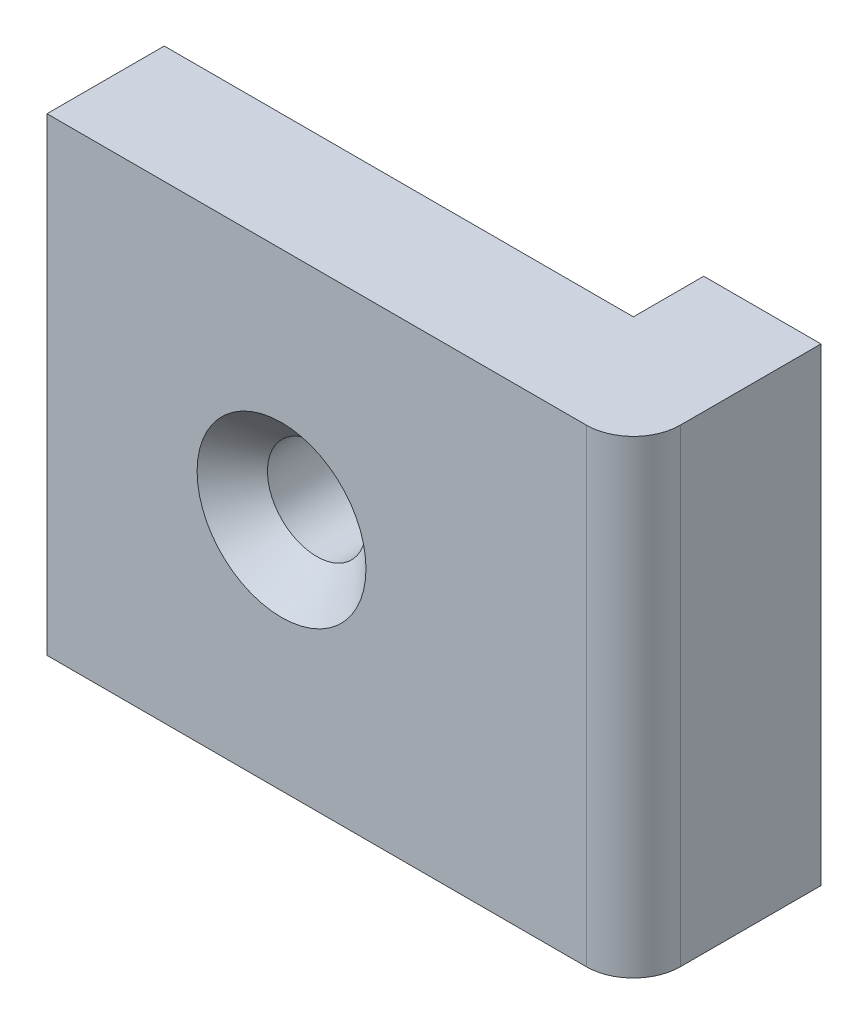
ISO-10303-21;
HEADER;
FILE_DESCRIPTION(('STEP AP214'),'2;1');
FILE_NAME('part.step','',(''),(''),'','','');
FILE_SCHEMA(('AUTOMOTIVE_DESIGN { 1 0 10303 214 1 1 1 1 }'));
ENDSEC;
DATA;
#1=APPLICATION_CONTEXT('core data for automotive mechanical design processes');
#2=APPLICATION_PROTOCOL_DEFINITION('international standard','automotive_design',2000,#1);
#3=PRODUCT_CONTEXT('',#1,'mechanical');
#4=PRODUCT('Part','Part','',(#3));
#5=PRODUCT_RELATED_PRODUCT_CATEGORY('part','',(#4));
#6=PRODUCT_DEFINITION_FORMATION('','',#4);
#7=PRODUCT_DEFINITION_CONTEXT('part definition',#1,'design');
#8=PRODUCT_DEFINITION('design','',#6,#7);
#9=PRODUCT_DEFINITION_SHAPE('','',#8);
#10=(LENGTH_UNIT() NAMED_UNIT(*) SI_UNIT(.MILLI.,.METRE.));
#11=(NAMED_UNIT(*) PLANE_ANGLE_UNIT() SI_UNIT($,.RADIAN.));
#12=(NAMED_UNIT(*) SI_UNIT($,.STERADIAN.) SOLID_ANGLE_UNIT());
#13=UNCERTAINTY_MEASURE_WITH_UNIT(LENGTH_MEASURE(1.E-05),#10,'distance_accuracy_value','');
#14=(GEOMETRIC_REPRESENTATION_CONTEXT(3) GLOBAL_UNCERTAINTY_ASSIGNED_CONTEXT((#13)) GLOBAL_UNIT_ASSIGNED_CONTEXT((#10,
#11,#12)) REPRESENTATION_CONTEXT('',''));
#15=CARTESIAN_POINT('',(0.,0.,0.));
#16=DIRECTION('',(0.,0.,1.));
#17=DIRECTION('',(1.,0.,0.));
#18=AXIS2_PLACEMENT_3D('',#15,#16,#17);
#19=CARTESIAN_POINT('',(0.,0.,0.));
#20=DIRECTION('',(0.,0.,1.));
#21=DIRECTION('',(1.,0.,0.));
#22=AXIS2_PLACEMENT_3D('',#19,#20,#21);
#23=PLANE('',#22);
#24=CARTESIAN_POINT('',(0.,0.,0.));
#25=DIRECTION('',(0.,0.,1.));
#26=DIRECTION('',(1.,0.,0.));
#27=AXIS2_PLACEMENT_3D('',#24,#25,#26);
#28=CIRCLE('',#27,2.1);
#29=CARTESIAN_POINT('',(2.10000000000001,0.,0.));
#30=VERTEX_POINT('',#29);
#31=EDGE_CURVE('E169',#30,#30,#28,.T.);
#32=ORIENTED_EDGE('',*,*,#31,.T.);
#33=EDGE_LOOP('',(#32));
#34=FACE_BOUND('',#33,.T.);
#35=DIRECTION('',(1.,0.,0.));
#36=VECTOR('',#35,1.);
#37=CARTESIAN_POINT('',(7.,2.75,0.));
#38=LINE('',#37,#36);
#39=CARTESIAN_POINT('',(7.,2.75,0.));
#40=VERTEX_POINT('',#39);
#41=CARTESIAN_POINT('',(10.,2.75,0.));
#42=VERTEX_POINT('',#41);
#43=EDGE_CURVE('E310',#40,#42,#38,.T.);
#44=ORIENTED_EDGE('',*,*,#43,.F.);
#45=DIRECTION('',(0.,1.,0.));
#46=VECTOR('',#45,1.);
#47=CARTESIAN_POINT('',(7.,-2.75,0.));
#48=LINE('',#47,#46);
#49=CARTESIAN_POINT('',(7.,-2.75,0.));
#50=VERTEX_POINT('',#49);
#51=EDGE_CURVE('E156',#50,#40,#48,.T.);
#52=ORIENTED_EDGE('',*,*,#51,.F.);
#53=DIRECTION('',(-1.,0.,0.));
#54=VECTOR('',#53,1.);
#55=CARTESIAN_POINT('',(7.,-2.75,0.));
#56=LINE('',#55,#54);
#57=CARTESIAN_POINT('',(10.,-2.75,0.));
#58=VERTEX_POINT('',#57);
#59=EDGE_CURVE('E138',#58,#50,#56,.T.);
#60=ORIENTED_EDGE('',*,*,#59,.F.);
#61=DIRECTION('',(0.,1.,0.));
#62=VECTOR('',#61,1.);
#63=CARTESIAN_POINT('',(10.,9.99999999999999,0.));
#64=LINE('',#63,#62);
#65=CARTESIAN_POINT('',(10.,-10.,0.));
#66=VERTEX_POINT('',#65);
#67=EDGE_CURVE('E153',#66,#58,#64,.T.);
#68=ORIENTED_EDGE('',*,*,#67,.F.);
#69=DIRECTION('',(1.,0.,0.));
#70=VECTOR('',#69,1.);
#71=CARTESIAN_POINT('',(-10.,-10.,0.));
#72=LINE('',#71,#70);
#73=CARTESIAN_POINT('',(-10.,-10.,0.));
#74=VERTEX_POINT('',#73);
#75=EDGE_CURVE('E176',#74,#66,#72,.T.);
#76=ORIENTED_EDGE('',*,*,#75,.F.);
#77=DIRECTION('',(0.,-1.,0.));
#78=VECTOR('',#77,1.);
#79=CARTESIAN_POINT('',(-10.,9.99999999999999,0.));
#80=LINE('',#79,#78);
#81=CARTESIAN_POINT('',(-10.,9.99999999999999,0.));
#82=VERTEX_POINT('',#81);
#83=EDGE_CURVE('E167',#82,#74,#80,.T.);
#84=ORIENTED_EDGE('',*,*,#83,.F.);
#85=DIRECTION('',(-1.,0.,0.));
#86=VECTOR('',#85,1.);
#87=CARTESIAN_POINT('',(-10.,9.99999999999999,0.));
#88=LINE('',#87,#86);
#89=CARTESIAN_POINT('',(10.,9.99999999999999,0.));
#90=VERTEX_POINT('',#89);
#91=EDGE_CURVE('E162',#90,#82,#88,.T.);
#92=ORIENTED_EDGE('',*,*,#91,.F.);
#93=EDGE_CURVE('E163',#42,#90,#64,.T.);
#94=ORIENTED_EDGE('',*,*,#93,.F.);
#95=EDGE_LOOP('',(#44,#52,#60,#68,#76,#84,#92,#94));
#96=FACE_BOUND('',#95,.T.);
#97=ADVANCED_FACE('F47',(#34,#96),#23,.F.);
#98=CARTESIAN_POINT('',(10.,0.,0.));
#99=DIRECTION('',(1.,0.,0.));
#100=DIRECTION('',(0.,1.,0.));
#101=AXIS2_PLACEMENT_3D('',#98,#99,#100);
#102=PLANE('',#101);
#103=DIRECTION('',(0.,0.,1.));
#104=VECTOR('',#103,1.);
#105=CARTESIAN_POINT('',(10.,2.75,-9.26498204307084));
#106=LINE('',#105,#104);
#107=CARTESIAN_POINT('',(10.,2.75,-3.));
#108=VERTEX_POINT('',#107);
#109=EDGE_CURVE('E64',#108,#42,#106,.T.);
#110=ORIENTED_EDGE('',*,*,#109,.T.);
#111=ORIENTED_EDGE('',*,*,#93,.T.);
#112=DIRECTION('',(0.,0.,1.));
#113=VECTOR('',#112,1.);
#114=CARTESIAN_POINT('',(10.,9.99999999999999,5.));
#115=LINE('',#114,#113);
#116=CARTESIAN_POINT('',(10.,9.99999999999999,-3.));
#117=VERTEX_POINT('',#116);
#118=EDGE_CURVE('E281',#117,#90,#115,.T.);
#119=ORIENTED_EDGE('',*,*,#118,.F.);
#120=DIRECTION('',(0.,1.,0.));
#121=VECTOR('',#120,1.);
#122=CARTESIAN_POINT('',(10.,9.99999999999999,-3.));
#123=LINE('',#122,#121);
#124=EDGE_CURVE('E277',#108,#117,#123,.T.);
#125=ORIENTED_EDGE('',*,*,#124,.F.);
#126=EDGE_LOOP('',(#110,#111,#119,#125));
#127=FACE_BOUND('',#126,.T.);
#128=ADVANCED_FACE('F216',(#127),#102,.F.);
#129=DIRECTION('',(0.,0.,1.));
#130=VECTOR('',#129,1.);
#131=CARTESIAN_POINT('',(10.,-2.75,-9.26498204307084));
#132=LINE('',#131,#130);
#133=CARTESIAN_POINT('',(10.,-2.75,-3.));
#134=VERTEX_POINT('',#133);
#135=EDGE_CURVE('E134',#134,#58,#132,.T.);
#136=ORIENTED_EDGE('',*,*,#135,.F.);
#137=CARTESIAN_POINT('',(10.,-10.,-3.));
#138=VERTEX_POINT('',#137);
#139=EDGE_CURVE('E278',#138,#134,#123,.T.);
#140=ORIENTED_EDGE('',*,*,#139,.F.);
#141=DIRECTION('',(0.,0.,-1.));
#142=VECTOR('',#141,1.);
#143=CARTESIAN_POINT('',(10.,-10.,5.));
#144=LINE('',#143,#142);
#145=EDGE_CURVE('E160',#66,#138,#144,.T.);
#146=ORIENTED_EDGE('',*,*,#145,.F.);
#147=ORIENTED_EDGE('',*,*,#67,.T.);
#148=EDGE_LOOP('',(#136,#140,#146,#147));
#149=FACE_BOUND('',#148,.T.);
#150=ADVANCED_FACE('F159',(#149),#102,.F.);
#151=CARTESIAN_POINT('',(0.,0.,5.));
#152=DIRECTION('',(0.,0.,1.));
#153=DIRECTION('',(1.,0.,0.));
#154=AXIS2_PLACEMENT_3D('',#151,#152,#153);
#155=PLANE('',#154);
#156=CARTESIAN_POINT('',(0.,0.,5.));
#157=DIRECTION('',(0.,0.,1.));
#158=DIRECTION('',(1.,0.,0.));
#159=AXIS2_PLACEMENT_3D('',#156,#157,#158);
#160=CIRCLE('',#159,3.6);
#161=CARTESIAN_POINT('',(3.60000000000001,0.,5.));
#162=VERTEX_POINT('',#161);
#163=EDGE_CURVE('E11',#162,#162,#160,.F.);
#164=ORIENTED_EDGE('',*,*,#163,.T.);
#165=EDGE_LOOP('',(#164));
#166=FACE_BOUND('',#165,.T.);
#167=DIRECTION('',(1.,0.,0.));
#168=VECTOR('',#167,1.);
#169=CARTESIAN_POINT('',(-10.,-10.,5.));
#170=LINE('',#169,#168);
#171=CARTESIAN_POINT('',(-10.,-10.,5.));
#172=VERTEX_POINT('',#171);
#173=CARTESIAN_POINT('',(13.,-10.,5.));
#174=VERTEX_POINT('',#173);
#175=EDGE_CURVE('E171',#172,#174,#170,.T.);
#176=ORIENTED_EDGE('',*,*,#175,.T.);
#177=DIRECTION('',(0.,-1.,0.));
#178=VECTOR('',#177,1.);
#179=CARTESIAN_POINT('',(13.,0.,5.));
#180=LINE('',#179,#178);
#181=CARTESIAN_POINT('',(13.,9.99999999999999,5.));
#182=VERTEX_POINT('',#181);
#183=EDGE_CURVE('E72',#174,#182,#180,.F.);
#184=ORIENTED_EDGE('',*,*,#183,.T.);
#185=DIRECTION('',(-1.,0.,0.));
#186=VECTOR('',#185,1.);
#187=CARTESIAN_POINT('',(-10.,9.99999999999999,5.));
#188=LINE('',#187,#186);
#189=CARTESIAN_POINT('',(-10.,9.99999999999999,5.));
#190=VERTEX_POINT('',#189);
#191=EDGE_CURVE('E179',#182,#190,#188,.T.);
#192=ORIENTED_EDGE('',*,*,#191,.T.);
#193=DIRECTION('',(0.,-1.,0.));
#194=VECTOR('',#193,1.);
#195=CARTESIAN_POINT('',(-10.,9.99999999999999,5.));
#196=LINE('',#195,#194);
#197=EDGE_CURVE('E291',#190,#172,#196,.T.);
#198=ORIENTED_EDGE('',*,*,#197,.T.);
#199=EDGE_LOOP('',(#176,#184,#192,#198));
#200=FACE_BOUND('',#199,.T.);
#201=ADVANCED_FACE('F228',(#166,#200),#155,.T.);
#202=CARTESIAN_POINT('',(-10.,9.99999999999999,5.));
#203=DIRECTION('',(0.,-1.,0.));
#204=DIRECTION('',(0.,0.,-1.));
#205=AXIS2_PLACEMENT_3D('',#202,#203,#204);
#206=PLANE('',#205);
#207=ORIENTED_EDGE('',*,*,#191,.F.);
#208=CARTESIAN_POINT('',(13.,9.99999999999999,3.));
#209=DIRECTION('',(0.,-1.,0.));
#210=DIRECTION('',(0.,0.,-1.));
#211=AXIS2_PLACEMENT_3D('',#208,#209,#210);
#212=CIRCLE('',#211,2.);
#213=CARTESIAN_POINT('',(15.,9.99999999999999,3.));
#214=VERTEX_POINT('',#213);
#215=EDGE_CURVE('E197',#182,#214,#212,.F.);
#216=ORIENTED_EDGE('',*,*,#215,.T.);
#217=DIRECTION('',(0.,0.,1.));
#218=VECTOR('',#217,1.);
#219=CARTESIAN_POINT('',(15.,9.99999999999999,5.));
#220=LINE('',#219,#218);
#221=CARTESIAN_POINT('',(15.,9.99999999999999,-3.));
#222=VERTEX_POINT('',#221);
#223=EDGE_CURVE('E258',#222,#214,#220,.T.);
#224=ORIENTED_EDGE('',*,*,#223,.F.);
#225=DIRECTION('',(-1.,0.,0.));
#226=VECTOR('',#225,1.);
#227=CARTESIAN_POINT('',(15.,9.99999999999999,-3.));
#228=LINE('',#227,#226);
#229=EDGE_CURVE('E265',#222,#117,#228,.T.);
#230=ORIENTED_EDGE('',*,*,#229,.T.);
#231=ORIENTED_EDGE('',*,*,#118,.T.);
#232=ORIENTED_EDGE('',*,*,#91,.T.);
#233=DIRECTION('',(0.,0.,-1.));
#234=VECTOR('',#233,1.);
#235=CARTESIAN_POINT('',(-10.,9.99999999999999,5.));
#236=LINE('',#235,#234);
#237=EDGE_CURVE('E184',#190,#82,#236,.T.);
#238=ORIENTED_EDGE('',*,*,#237,.F.);
#239=EDGE_LOOP('',(#207,#216,#224,#230,#231,#232,#238));
#240=FACE_BOUND('',#239,.T.);
#241=ADVANCED_FACE('F237',(#240),#206,.F.);
#242=CARTESIAN_POINT('',(-10.,9.99999999999999,5.));
#243=DIRECTION('',(1.,0.,0.));
#244=DIRECTION('',(0.,0.,-1.));
#245=AXIS2_PLACEMENT_3D('',#242,#243,#244);
#246=PLANE('',#245);
#247=ORIENTED_EDGE('',*,*,#83,.T.);
#248=DIRECTION('',(0.,0.,-1.));
#249=VECTOR('',#248,1.);
#250=CARTESIAN_POINT('',(-10.,-10.,5.));
#251=LINE('',#250,#249);
#252=EDGE_CURVE('E180',#172,#74,#251,.T.);
#253=ORIENTED_EDGE('',*,*,#252,.F.);
#254=ORIENTED_EDGE('',*,*,#197,.F.);
#255=ORIENTED_EDGE('',*,*,#237,.T.);
#256=EDGE_LOOP('',(#247,#253,#254,#255));
#257=FACE_BOUND('',#256,.T.);
#258=ADVANCED_FACE('F233',(#257),#246,.F.);
#259=CARTESIAN_POINT('',(-10.,-10.,5.));
#260=DIRECTION('',(0.,1.,0.));
#261=DIRECTION('',(0.,0.,1.));
#262=AXIS2_PLACEMENT_3D('',#259,#260,#261);
#263=PLANE('',#262);
#264=DIRECTION('',(0.,0.,-1.));
#265=VECTOR('',#264,1.);
#266=CARTESIAN_POINT('',(15.,-10.,5.));
#267=LINE('',#266,#265);
#268=CARTESIAN_POINT('',(15.,-10.,3.));
#269=VERTEX_POINT('',#268);
#270=CARTESIAN_POINT('',(15.,-10.,-3.));
#271=VERTEX_POINT('',#270);
#272=EDGE_CURVE('E271',#269,#271,#267,.T.);
#273=ORIENTED_EDGE('',*,*,#272,.F.);
#274=CARTESIAN_POINT('',(13.,-10.,3.));
#275=DIRECTION('',(0.,1.,0.));
#276=DIRECTION('',(0.,0.,1.));
#277=AXIS2_PLACEMENT_3D('',#274,#275,#276);
#278=CIRCLE('',#277,2.);
#279=EDGE_CURVE('E192',#269,#174,#278,.F.);
#280=ORIENTED_EDGE('',*,*,#279,.T.);
#281=ORIENTED_EDGE('',*,*,#175,.F.);
#282=ORIENTED_EDGE('',*,*,#252,.T.);
#283=ORIENTED_EDGE('',*,*,#75,.T.);
#284=ORIENTED_EDGE('',*,*,#145,.T.);
#285=DIRECTION('',(-1.,0.,0.));
#286=VECTOR('',#285,1.);
#287=CARTESIAN_POINT('',(15.,-10.,-3.));
#288=LINE('',#287,#286);
#289=EDGE_CURVE('E269',#271,#138,#288,.T.);
#290=ORIENTED_EDGE('',*,*,#289,.F.);
#291=EDGE_LOOP('',(#273,#280,#281,#282,#283,#284,#290));
#292=FACE_BOUND('',#291,.T.);
#293=ADVANCED_FACE('F230',(#292),#263,.F.);
#294=CARTESIAN_POINT('',(0.,0.,5.));
#295=DIRECTION('',(0.,0.,-1.));
#296=DIRECTION('',(-1.,0.,0.));
#297=AXIS2_PLACEMENT_3D('',#294,#295,#296);
#298=CYLINDRICAL_SURFACE('',#297,2.1);
#299=CARTESIAN_POINT('',(0.,0.,3.5));
#300=DIRECTION('',(0.,0.,1.));
#301=DIRECTION('',(1.,0.,0.));
#302=AXIS2_PLACEMENT_3D('',#299,#300,#301);
#303=CIRCLE('',#302,2.1);
#304=CARTESIAN_POINT('',(2.10000000000001,0.,3.5));
#305=VERTEX_POINT('',#304);
#306=EDGE_CURVE('E57',#305,#305,#303,.T.);
#307=ORIENTED_EDGE('',*,*,#306,.T.);
#308=EDGE_LOOP('',(#307));
#309=FACE_BOUND('',#308,.T.);
#310=ORIENTED_EDGE('',*,*,#31,.F.);
#311=EDGE_LOOP('',(#310));
#312=FACE_BOUND('',#311,.T.);
#313=ADVANCED_FACE('F203',(#309,#312),#298,.F.);
#314=CARTESIAN_POINT('',(15.,9.99999999999999,-3.));
#315=DIRECTION('',(0.,0.,1.));
#316=DIRECTION('',(0.,-1.,0.));
#317=AXIS2_PLACEMENT_3D('',#314,#315,#316);
#318=PLANE('',#317);
#319=ORIENTED_EDGE('',*,*,#139,.T.);
#320=DIRECTION('',(1.,0.,0.));
#321=VECTOR('',#320,1.);
#322=CARTESIAN_POINT('',(7.,-2.75,-3.));
#323=LINE('',#322,#321);
#324=CARTESIAN_POINT('',(7.,-2.75,-3.));
#325=VERTEX_POINT('',#324);
#326=EDGE_CURVE('E140',#325,#134,#323,.T.);
#327=ORIENTED_EDGE('',*,*,#326,.F.);
#328=DIRECTION('',(0.,-1.,0.));
#329=VECTOR('',#328,1.);
#330=CARTESIAN_POINT('',(7.,-2.75,-3.));
#331=LINE('',#330,#329);
#332=CARTESIAN_POINT('',(7.,2.75,-3.));
#333=VERTEX_POINT('',#332);
#334=EDGE_CURVE('E301',#333,#325,#331,.T.);
#335=ORIENTED_EDGE('',*,*,#334,.F.);
#336=DIRECTION('',(-1.,0.,0.));
#337=VECTOR('',#336,1.);
#338=CARTESIAN_POINT('',(7.,2.75,-3.));
#339=LINE('',#338,#337);
#340=EDGE_CURVE('E146',#108,#333,#339,.T.);
#341=ORIENTED_EDGE('',*,*,#340,.F.);
#342=ORIENTED_EDGE('',*,*,#124,.T.);
#343=ORIENTED_EDGE('',*,*,#229,.F.);
#344=DIRECTION('',(0.,1.,0.));
#345=VECTOR('',#344,1.);
#346=CARTESIAN_POINT('',(15.,9.99999999999999,-3.));
#347=LINE('',#346,#345);
#348=EDGE_CURVE('E262',#271,#222,#347,.T.);
#349=ORIENTED_EDGE('',*,*,#348,.F.);
#350=ORIENTED_EDGE('',*,*,#289,.T.);
#351=EDGE_LOOP('',(#319,#327,#335,#341,#342,#343,#349,#350));
#352=FACE_BOUND('',#351,.T.);
#353=ADVANCED_FACE('F250',(#352),#318,.F.);
#354=CARTESIAN_POINT('',(15.,0.,0.));
#355=DIRECTION('',(1.,0.,0.));
#356=DIRECTION('',(0.,1.,0.));
#357=AXIS2_PLACEMENT_3D('',#354,#355,#356);
#358=PLANE('',#357);
#359=ORIENTED_EDGE('',*,*,#223,.T.);
#360=DIRECTION('',(0.,-1.,0.));
#361=VECTOR('',#360,1.);
#362=CARTESIAN_POINT('',(15.,0.,3.));
#363=LINE('',#362,#361);
#364=EDGE_CURVE('E188',#214,#269,#363,.T.);
#365=ORIENTED_EDGE('',*,*,#364,.T.);
#366=ORIENTED_EDGE('',*,*,#272,.T.);
#367=ORIENTED_EDGE('',*,*,#348,.T.);
#368=EDGE_LOOP('',(#359,#365,#366,#367));
#369=FACE_BOUND('',#368,.T.);
#370=ADVANCED_FACE('F243',(#369),#358,.T.);
#371=CARTESIAN_POINT('',(13.,0.,3.));
#372=DIRECTION('',(0.,-1.,0.));
#373=DIRECTION('',(1.,0.,0.));
#374=AXIS2_PLACEMENT_3D('',#371,#372,#373);
#375=CYLINDRICAL_SURFACE('',#374,2.);
#376=ORIENTED_EDGE('',*,*,#215,.F.);
#377=ORIENTED_EDGE('',*,*,#183,.F.);
#378=ORIENTED_EDGE('',*,*,#279,.F.);
#379=ORIENTED_EDGE('',*,*,#364,.F.);
#380=EDGE_LOOP('',(#376,#377,#378,#379));
#381=FACE_BOUND('',#380,.T.);
#382=ADVANCED_FACE('F241',(#381),#375,.T.);
#383=CARTESIAN_POINT('',(7.,2.75,-9.26498204307084));
#384=DIRECTION('',(0.,-1.,0.));
#385=DIRECTION('',(1.,0.,0.));
#386=AXIS2_PLACEMENT_3D('',#383,#384,#385);
#387=PLANE('',#386);
#388=ORIENTED_EDGE('',*,*,#109,.F.);
#389=ORIENTED_EDGE('',*,*,#340,.T.);
#390=DIRECTION('',(0.,0.,1.));
#391=VECTOR('',#390,1.);
#392=CARTESIAN_POINT('',(7.,2.75,-9.26498204307084));
#393=LINE('',#392,#391);
#394=EDGE_CURVE('E305',#333,#40,#393,.T.);
#395=ORIENTED_EDGE('',*,*,#394,.T.);
#396=ORIENTED_EDGE('',*,*,#43,.T.);
#397=EDGE_LOOP('',(#388,#389,#395,#396));
#398=FACE_BOUND('',#397,.T.);
#399=ADVANCED_FACE('F242',(#398),#387,.F.);
#400=CARTESIAN_POINT('',(7.,-2.75,-9.26498204307084));
#401=DIRECTION('',(1.,0.,0.));
#402=DIRECTION('',(0.,0.,-1.));
#403=AXIS2_PLACEMENT_3D('',#400,#401,#402);
#404=PLANE('',#403);
#405=ORIENTED_EDGE('',*,*,#394,.F.);
#406=ORIENTED_EDGE('',*,*,#334,.T.);
#407=DIRECTION('',(0.,0.,1.));
#408=VECTOR('',#407,1.);
#409=CARTESIAN_POINT('',(7.,-2.75,-9.26498204307084));
#410=LINE('',#409,#408);
#411=EDGE_CURVE('E147',#325,#50,#410,.T.);
#412=ORIENTED_EDGE('',*,*,#411,.T.);
#413=ORIENTED_EDGE('',*,*,#51,.T.);
#414=EDGE_LOOP('',(#405,#406,#412,#413));
#415=FACE_BOUND('',#414,.T.);
#416=ADVANCED_FACE('F212',(#415),#404,.F.);
#417=CARTESIAN_POINT('',(7.,-2.75,-9.26498204307084));
#418=DIRECTION('',(0.,1.,0.));
#419=DIRECTION('',(-1.,0.,0.));
#420=AXIS2_PLACEMENT_3D('',#417,#418,#419);
#421=PLANE('',#420);
#422=ORIENTED_EDGE('',*,*,#411,.F.);
#423=ORIENTED_EDGE('',*,*,#326,.T.);
#424=ORIENTED_EDGE('',*,*,#135,.T.);
#425=ORIENTED_EDGE('',*,*,#59,.T.);
#426=EDGE_LOOP('',(#422,#423,#424,#425));
#427=FACE_BOUND('',#426,.T.);
#428=ADVANCED_FACE('F137',(#427),#421,.F.);
#429=CARTESIAN_POINT('',(0.,0.,3.5));
#430=DIRECTION('',(0.,0.,1.));
#431=DIRECTION('',(1.,0.,0.));
#432=AXIS2_PLACEMENT_3D('',#429,#430,#431);
#433=CONICAL_SURFACE('',#432,2.1,0.78539816339745);
#434=ORIENTED_EDGE('',*,*,#163,.F.);
#435=EDGE_LOOP('',(#434));
#436=FACE_BOUND('',#435,.T.);
#437=ORIENTED_EDGE('',*,*,#306,.F.);
#438=EDGE_LOOP('',(#437));
#439=FACE_BOUND('',#438,.T.);
#440=ADVANCED_FACE('F50',(#436,#439),#433,.F.);
#441=CLOSED_SHELL('',(#97,#128,#150,#201,#241,#258,#293,#313,#353,#370,#382,#399,#416,#428,#440));
#442=MANIFOLD_SOLID_BREP('B2',#441);
#443=ADVANCED_BREP_SHAPE_REPRESENTATION('',(#18,#442),#14);
#444=SHAPE_DEFINITION_REPRESENTATION(#9,#443);
ENDSEC;
END-ISO-10303-21;
